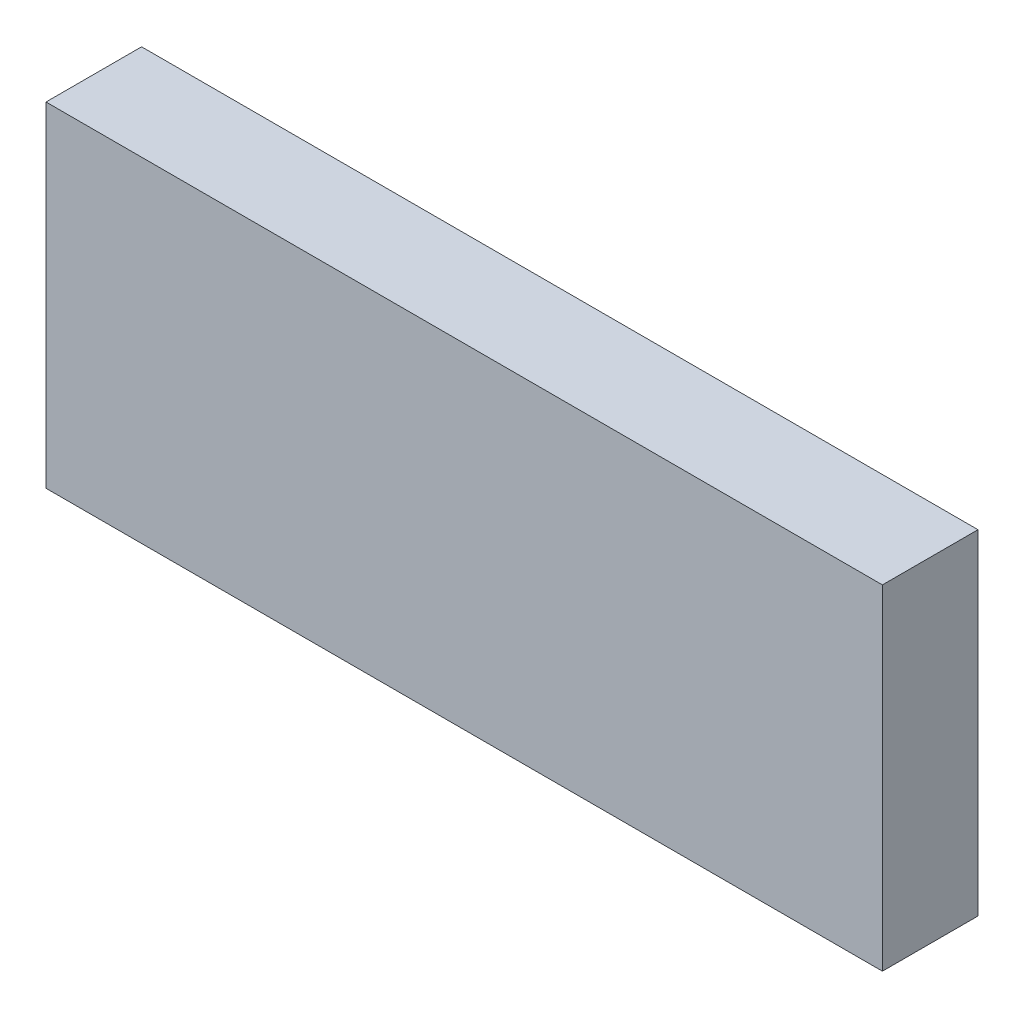
ISO-10303-21;
HEADER;
FILE_DESCRIPTION(('STEP AP214'),'2;1');
FILE_NAME('part.step','',(''),(''),'','','');
FILE_SCHEMA(('AUTOMOTIVE_DESIGN { 1 0 10303 214 1 1 1 1 }'));
ENDSEC;
DATA;
#1=APPLICATION_CONTEXT('core data for automotive mechanical design processes');
#2=APPLICATION_PROTOCOL_DEFINITION('international standard','automotive_design',2000,#1);
#3=PRODUCT_CONTEXT('',#1,'mechanical');
#4=PRODUCT('Part','Part','',(#3));
#5=PRODUCT_RELATED_PRODUCT_CATEGORY('part','',(#4));
#6=PRODUCT_DEFINITION_FORMATION('','',#4);
#7=PRODUCT_DEFINITION_CONTEXT('part definition',#1,'design');
#8=PRODUCT_DEFINITION('design','',#6,#7);
#9=PRODUCT_DEFINITION_SHAPE('','',#8);
#10=(LENGTH_UNIT() NAMED_UNIT(*) SI_UNIT(.MILLI.,.METRE.));
#11=(NAMED_UNIT(*) PLANE_ANGLE_UNIT() SI_UNIT($,.RADIAN.));
#12=(NAMED_UNIT(*) SI_UNIT($,.STERADIAN.) SOLID_ANGLE_UNIT());
#13=UNCERTAINTY_MEASURE_WITH_UNIT(LENGTH_MEASURE(1.E-05),#10,'distance_accuracy_value','');
#14=(GEOMETRIC_REPRESENTATION_CONTEXT(3) GLOBAL_UNCERTAINTY_ASSIGNED_CONTEXT((#13)) GLOBAL_UNIT_ASSIGNED_CONTEXT((#10,
#11,#12)) REPRESENTATION_CONTEXT('',''));
#15=CARTESIAN_POINT('',(0.,0.,0.));
#16=DIRECTION('',(0.,0.,1.));
#17=DIRECTION('',(1.,0.,0.));
#18=AXIS2_PLACEMENT_3D('',#15,#16,#17);
#19=CARTESIAN_POINT('',(0.,0.,4.));
#20=DIRECTION('',(1.,0.,0.));
#21=DIRECTION('',(0.,0.,-1.));
#22=AXIS2_PLACEMENT_3D('',#19,#20,#21);
#23=PLANE('',#22);
#24=DIRECTION('',(0.,-1.,0.));
#25=VECTOR('',#24,1.);
#26=CARTESIAN_POINT('',(0.,0.,0.));
#27=LINE('',#26,#25);
#28=CARTESIAN_POINT('',(0.,14.,0.));
#29=VERTEX_POINT('',#28);
#30=CARTESIAN_POINT('',(0.,0.,0.));
#31=VERTEX_POINT('',#30);
#32=EDGE_CURVE('E114',#29,#31,#27,.T.);
#33=ORIENTED_EDGE('',*,*,#32,.T.);
#34=DIRECTION('',(0.,0.,-1.));
#35=VECTOR('',#34,1.);
#36=CARTESIAN_POINT('',(0.,0.,4.));
#37=LINE('',#36,#35);
#38=CARTESIAN_POINT('',(0.,0.,4.));
#39=VERTEX_POINT('',#38);
#40=EDGE_CURVE('E11',#39,#31,#37,.T.);
#41=ORIENTED_EDGE('',*,*,#40,.F.);
#42=DIRECTION('',(0.,-1.,0.));
#43=VECTOR('',#42,1.);
#44=CARTESIAN_POINT('',(0.,0.,4.));
#45=LINE('',#44,#43);
#46=CARTESIAN_POINT('',(0.,14.,4.));
#47=VERTEX_POINT('',#46);
#48=EDGE_CURVE('E100',#47,#39,#45,.T.);
#49=ORIENTED_EDGE('',*,*,#48,.F.);
#50=DIRECTION('',(0.,0.,-1.));
#51=VECTOR('',#50,1.);
#52=CARTESIAN_POINT('',(0.,14.,4.));
#53=LINE('',#52,#51);
#54=EDGE_CURVE('E108',#47,#29,#53,.T.);
#55=ORIENTED_EDGE('',*,*,#54,.T.);
#56=EDGE_LOOP('',(#33,#41,#49,#55));
#57=FACE_BOUND('',#56,.T.);
#58=ADVANCED_FACE('F44',(#57),#23,.F.);
#59=CARTESIAN_POINT('',(0.,0.,4.));
#60=DIRECTION('',(0.,1.,0.));
#61=DIRECTION('',(0.,0.,1.));
#62=AXIS2_PLACEMENT_3D('',#59,#60,#61);
#63=PLANE('',#62);
#64=DIRECTION('',(1.,0.,0.));
#65=VECTOR('',#64,1.);
#66=CARTESIAN_POINT('',(0.,0.,0.));
#67=LINE('',#66,#65);
#68=CARTESIAN_POINT('',(35.,0.,0.));
#69=VERTEX_POINT('',#68);
#70=EDGE_CURVE('E105',#31,#69,#67,.T.);
#71=ORIENTED_EDGE('',*,*,#70,.T.);
#72=DIRECTION('',(0.,0.,-1.));
#73=VECTOR('',#72,1.);
#74=CARTESIAN_POINT('',(35.,0.,4.));
#75=LINE('',#74,#73);
#76=CARTESIAN_POINT('',(35.,0.,4.));
#77=VERTEX_POINT('',#76);
#78=EDGE_CURVE('E53',#77,#69,#75,.T.);
#79=ORIENTED_EDGE('',*,*,#78,.F.);
#80=DIRECTION('',(1.,0.,0.));
#81=VECTOR('',#80,1.);
#82=CARTESIAN_POINT('',(0.,0.,4.));
#83=LINE('',#82,#81);
#84=EDGE_CURVE('E95',#39,#77,#83,.T.);
#85=ORIENTED_EDGE('',*,*,#84,.F.);
#86=ORIENTED_EDGE('',*,*,#40,.T.);
#87=EDGE_LOOP('',(#71,#79,#85,#86));
#88=FACE_BOUND('',#87,.T.);
#89=ADVANCED_FACE('F101',(#88),#63,.F.);
#90=CARTESIAN_POINT('',(35.,0.,4.));
#91=DIRECTION('',(-1.,0.,0.));
#92=DIRECTION('',(0.,0.,1.));
#93=AXIS2_PLACEMENT_3D('',#90,#91,#92);
#94=PLANE('',#93);
#95=DIRECTION('',(0.,1.,0.));
#96=VECTOR('',#95,1.);
#97=CARTESIAN_POINT('',(35.,0.,0.));
#98=LINE('',#97,#96);
#99=CARTESIAN_POINT('',(35.,14.,0.));
#100=VERTEX_POINT('',#99);
#101=EDGE_CURVE('E80',#69,#100,#98,.T.);
#102=ORIENTED_EDGE('',*,*,#101,.T.);
#103=DIRECTION('',(0.,0.,-1.));
#104=VECTOR('',#103,1.);
#105=CARTESIAN_POINT('',(35.,14.,4.));
#106=LINE('',#105,#104);
#107=CARTESIAN_POINT('',(35.,14.,4.));
#108=VERTEX_POINT('',#107);
#109=EDGE_CURVE('E102',#108,#100,#106,.T.);
#110=ORIENTED_EDGE('',*,*,#109,.F.);
#111=DIRECTION('',(0.,1.,0.));
#112=VECTOR('',#111,1.);
#113=CARTESIAN_POINT('',(35.,0.,4.));
#114=LINE('',#113,#112);
#115=EDGE_CURVE('E92',#77,#108,#114,.T.);
#116=ORIENTED_EDGE('',*,*,#115,.F.);
#117=ORIENTED_EDGE('',*,*,#78,.T.);
#118=EDGE_LOOP('',(#102,#110,#116,#117));
#119=FACE_BOUND('',#118,.T.);
#120=ADVANCED_FACE('F104',(#119),#94,.F.);
#121=CARTESIAN_POINT('',(0.,14.,4.));
#122=DIRECTION('',(0.,-1.,0.));
#123=DIRECTION('',(0.,0.,-1.));
#124=AXIS2_PLACEMENT_3D('',#121,#122,#123);
#125=PLANE('',#124);
#126=DIRECTION('',(-1.,0.,0.));
#127=VECTOR('',#126,1.);
#128=CARTESIAN_POINT('',(0.,14.,0.));
#129=LINE('',#128,#127);
#130=EDGE_CURVE('E81',#100,#29,#129,.T.);
#131=ORIENTED_EDGE('',*,*,#130,.T.);
#132=ORIENTED_EDGE('',*,*,#54,.F.);
#133=DIRECTION('',(-1.,0.,0.));
#134=VECTOR('',#133,1.);
#135=CARTESIAN_POINT('',(0.,14.,4.));
#136=LINE('',#135,#134);
#137=EDGE_CURVE('E64',#108,#47,#136,.T.);
#138=ORIENTED_EDGE('',*,*,#137,.F.);
#139=ORIENTED_EDGE('',*,*,#109,.T.);
#140=EDGE_LOOP('',(#131,#132,#138,#139));
#141=FACE_BOUND('',#140,.T.);
#142=ADVANCED_FACE('F130',(#141),#125,.F.);
#143=CARTESIAN_POINT('',(0.,0.,4.));
#144=DIRECTION('',(0.,0.,-1.));
#145=DIRECTION('',(-1.,0.,0.));
#146=AXIS2_PLACEMENT_3D('',#143,#144,#145);
#147=PLANE('',#146);
#148=ORIENTED_EDGE('',*,*,#48,.T.);
#149=ORIENTED_EDGE('',*,*,#84,.T.);
#150=ORIENTED_EDGE('',*,*,#115,.T.);
#151=ORIENTED_EDGE('',*,*,#137,.T.);
#152=EDGE_LOOP('',(#148,#149,#150,#151));
#153=FACE_BOUND('',#152,.T.);
#154=ADVANCED_FACE('F91',(#153),#147,.F.);
#155=CARTESIAN_POINT('',(0.,0.,0.));
#156=DIRECTION('',(0.,0.,-1.));
#157=DIRECTION('',(-1.,0.,0.));
#158=AXIS2_PLACEMENT_3D('',#155,#156,#157);
#159=PLANE('',#158);
#160=ORIENTED_EDGE('',*,*,#32,.F.);
#161=ORIENTED_EDGE('',*,*,#130,.F.);
#162=ORIENTED_EDGE('',*,*,#101,.F.);
#163=ORIENTED_EDGE('',*,*,#70,.F.);
#164=EDGE_LOOP('',(#160,#161,#162,#163));
#165=FACE_BOUND('',#164,.T.);
#166=ADVANCED_FACE('F128',(#165),#159,.T.);
#167=CLOSED_SHELL('',(#58,#89,#120,#142,#154,#166));
#168=MANIFOLD_SOLID_BREP('B2',#167);
#169=ADVANCED_BREP_SHAPE_REPRESENTATION('',(#18,#168),#14);
#170=SHAPE_DEFINITION_REPRESENTATION(#9,#169);
ENDSEC;
END-ISO-10303-21;
